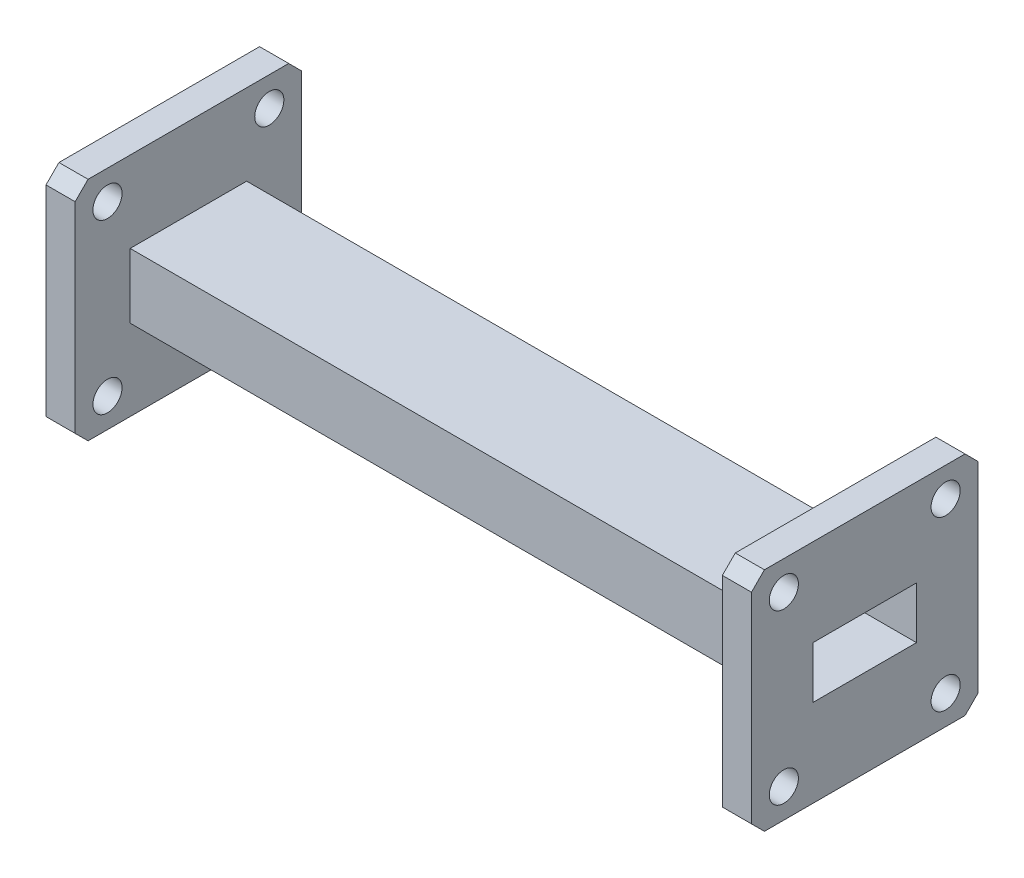
ISO-10303-21;
HEADER;
FILE_DESCRIPTION(('STEP AP214'),'2;1');
FILE_NAME('part.step','',(''),(''),'','','');
FILE_SCHEMA(('AUTOMOTIVE_DESIGN { 1 0 10303 214 1 1 1 1 }'));
ENDSEC;
DATA;
#1=APPLICATION_CONTEXT('core data for automotive mechanical design processes');
#2=APPLICATION_PROTOCOL_DEFINITION('international standard','automotive_design',2000,#1);
#3=PRODUCT_CONTEXT('',#1,'mechanical');
#4=PRODUCT('Part','Part','',(#3));
#5=PRODUCT_RELATED_PRODUCT_CATEGORY('part','',(#4));
#6=PRODUCT_DEFINITION_FORMATION('','',#4);
#7=PRODUCT_DEFINITION_CONTEXT('part definition',#1,'design');
#8=PRODUCT_DEFINITION('design','',#6,#7);
#9=PRODUCT_DEFINITION_SHAPE('','',#8);
#10=(LENGTH_UNIT() NAMED_UNIT(*) SI_UNIT(.MILLI.,.METRE.));
#11=(NAMED_UNIT(*) PLANE_ANGLE_UNIT() SI_UNIT($,.RADIAN.));
#12=(NAMED_UNIT(*) SI_UNIT($,.STERADIAN.) SOLID_ANGLE_UNIT());
#13=UNCERTAINTY_MEASURE_WITH_UNIT(LENGTH_MEASURE(1.E-05),#10,'distance_accuracy_value','');
#14=(GEOMETRIC_REPRESENTATION_CONTEXT(3) GLOBAL_UNCERTAINTY_ASSIGNED_CONTEXT((#13)) GLOBAL_UNIT_ASSIGNED_CONTEXT((#10,
#11,#12)) REPRESENTATION_CONTEXT('',''));
#15=CARTESIAN_POINT('',(0.,0.,0.));
#16=DIRECTION('',(0.,0.,1.));
#17=DIRECTION('',(1.,0.,0.));
#18=AXIS2_PLACEMENT_3D('',#15,#16,#17);
#19=CARTESIAN_POINT('',(4.5,0.,0.));
#20=DIRECTION('',(-1.,0.,0.));
#21=DIRECTION('',(0.,0.,1.));
#22=AXIS2_PLACEMENT_3D('',#19,#20,#21);
#23=PLANE('',#22);
#24=CARTESIAN_POINT('',(4.5,-13.,-12.5));
#25=DIRECTION('',(-1.,0.,0.));
#26=DIRECTION('',(0.,0.,1.));
#27=AXIS2_PLACEMENT_3D('',#24,#25,#26);
#28=CIRCLE('',#27,2.24999999999992);
#29=CARTESIAN_POINT('',(4.5,-13.,-10.2500000000001));
#30=VERTEX_POINT('',#29);
#31=EDGE_CURVE('E660',#30,#30,#28,.T.);
#32=ORIENTED_EDGE('',*,*,#31,.T.);
#33=EDGE_LOOP('',(#32));
#34=FACE_BOUND('',#33,.T.);
#35=CARTESIAN_POINT('',(4.5,13.,-12.5));
#36=DIRECTION('',(-1.,0.,0.));
#37=DIRECTION('',(0.,0.,1.));
#38=AXIS2_PLACEMENT_3D('',#35,#36,#37);
#39=CIRCLE('',#38,2.24999999999992);
#40=CARTESIAN_POINT('',(4.5,13.,-10.2500000000001));
#41=VERTEX_POINT('',#40);
#42=EDGE_CURVE('E406',#41,#41,#39,.T.);
#43=ORIENTED_EDGE('',*,*,#42,.T.);
#44=EDGE_LOOP('',(#43));
#45=FACE_BOUND('',#44,.T.);
#46=CARTESIAN_POINT('',(4.5,-13.,12.5));
#47=DIRECTION('',(-1.,0.,0.));
#48=DIRECTION('',(0.,0.,1.));
#49=AXIS2_PLACEMENT_3D('',#46,#47,#48);
#50=CIRCLE('',#49,2.24999999999992);
#51=CARTESIAN_POINT('',(4.5,-13.,14.7499999999999));
#52=VERTEX_POINT('',#51);
#53=EDGE_CURVE('E393',#52,#52,#50,.T.);
#54=ORIENTED_EDGE('',*,*,#53,.T.);
#55=EDGE_LOOP('',(#54));
#56=FACE_BOUND('',#55,.T.);
#57=CARTESIAN_POINT('',(4.5,13.,12.5));
#58=DIRECTION('',(-1.,0.,0.));
#59=DIRECTION('',(0.,0.,1.));
#60=AXIS2_PLACEMENT_3D('',#57,#58,#59);
#61=CIRCLE('',#60,2.24999999999992);
#62=CARTESIAN_POINT('',(4.5,13.,14.7499999999999));
#63=VERTEX_POINT('',#62);
#64=EDGE_CURVE('E217',#63,#63,#61,.T.);
#65=ORIENTED_EDGE('',*,*,#64,.T.);
#66=EDGE_LOOP('',(#65));
#67=FACE_BOUND('',#66,.T.);
#68=DIRECTION('',(0.,-1.,0.));
#69=VECTOR('',#68,1.);
#70=CARTESIAN_POINT('',(4.5,-17.5,17.5));
#71=LINE('',#70,#69);
#72=CARTESIAN_POINT('',(4.5,15.5,17.5));
#73=VERTEX_POINT('',#72);
#74=CARTESIAN_POINT('',(4.5,-15.5,17.5));
#75=VERTEX_POINT('',#74);
#76=EDGE_CURVE('E305',#73,#75,#71,.T.);
#77=ORIENTED_EDGE('',*,*,#76,.T.);
#78=DIRECTION('',(0.,0.707106781186548,0.707106781186548));
#79=VECTOR('',#78,1.);
#80=CARTESIAN_POINT('',(4.5,-17.5,15.5));
#81=LINE('',#80,#79);
#82=CARTESIAN_POINT('',(4.5,-17.5,15.5));
#83=VERTEX_POINT('',#82);
#84=EDGE_CURVE('E345',#75,#83,#81,.F.);
#85=ORIENTED_EDGE('',*,*,#84,.T.);
#86=DIRECTION('',(0.,0.,-1.));
#87=VECTOR('',#86,1.);
#88=CARTESIAN_POINT('',(4.5,-17.5,17.5));
#89=LINE('',#88,#87);
#90=CARTESIAN_POINT('',(4.5,-17.5,-15.5));
#91=VERTEX_POINT('',#90);
#92=EDGE_CURVE('E308',#83,#91,#89,.T.);
#93=ORIENTED_EDGE('',*,*,#92,.T.);
#94=DIRECTION('',(0.,-0.707106781186548,0.707106781186548));
#95=VECTOR('',#94,1.);
#96=CARTESIAN_POINT('',(4.5,-15.5,-17.5));
#97=LINE('',#96,#95);
#98=CARTESIAN_POINT('',(4.5,-15.5,-17.5));
#99=VERTEX_POINT('',#98);
#100=EDGE_CURVE('E343',#91,#99,#97,.F.);
#101=ORIENTED_EDGE('',*,*,#100,.T.);
#102=DIRECTION('',(0.,1.,0.));
#103=VECTOR('',#102,1.);
#104=CARTESIAN_POINT('',(4.5,-17.5,-17.5));
#105=LINE('',#104,#103);
#106=CARTESIAN_POINT('',(4.5,15.5,-17.5));
#107=VERTEX_POINT('',#106);
#108=EDGE_CURVE('E298',#99,#107,#105,.T.);
#109=ORIENTED_EDGE('',*,*,#108,.T.);
#110=DIRECTION('',(0.,-0.707106781186548,-0.707106781186548));
#111=VECTOR('',#110,1.);
#112=CARTESIAN_POINT('',(4.5,17.5,-15.5));
#113=LINE('',#112,#111);
#114=CARTESIAN_POINT('',(4.5,17.5,-15.5));
#115=VERTEX_POINT('',#114);
#116=EDGE_CURVE('E341',#107,#115,#113,.F.);
#117=ORIENTED_EDGE('',*,*,#116,.T.);
#118=DIRECTION('',(0.,0.,1.));
#119=VECTOR('',#118,1.);
#120=CARTESIAN_POINT('',(4.5,17.5,17.5));
#121=LINE('',#120,#119);
#122=CARTESIAN_POINT('',(4.5,17.5,15.5));
#123=VERTEX_POINT('',#122);
#124=EDGE_CURVE('E301',#115,#123,#121,.T.);
#125=ORIENTED_EDGE('',*,*,#124,.T.);
#126=DIRECTION('',(0.,0.707106781186548,-0.707106781186548));
#127=VECTOR('',#126,1.);
#128=CARTESIAN_POINT('',(4.5,15.5,17.5));
#129=LINE('',#128,#127);
#130=EDGE_CURVE('E339',#123,#73,#129,.F.);
#131=ORIENTED_EDGE('',*,*,#130,.T.);
#132=EDGE_LOOP('',(#77,#85,#93,#101,#109,#117,#125,#131));
#133=FACE_BOUND('',#132,.T.);
#134=DIRECTION('',(0.,1.,0.));
#135=VECTOR('',#134,1.);
#136=CARTESIAN_POINT('',(4.5,-5.00000000000001,-9.));
#137=LINE('',#136,#135);
#138=CARTESIAN_POINT('',(4.5,-5.00000000000001,-9.));
#139=VERTEX_POINT('',#138);
#140=CARTESIAN_POINT('',(4.5,5.00000000000001,-9.));
#141=VERTEX_POINT('',#140);
#142=EDGE_CURVE('E240',#139,#141,#137,.T.);
#143=ORIENTED_EDGE('',*,*,#142,.F.);
#144=DIRECTION('',(0.,0.,-1.));
#145=VECTOR('',#144,1.);
#146=CARTESIAN_POINT('',(4.5,-5.00000000000001,9.));
#147=LINE('',#146,#145);
#148=CARTESIAN_POINT('',(4.5,-5.00000000000001,9.));
#149=VERTEX_POINT('',#148);
#150=EDGE_CURVE('E254',#149,#139,#147,.T.);
#151=ORIENTED_EDGE('',*,*,#150,.F.);
#152=DIRECTION('',(0.,-1.,0.));
#153=VECTOR('',#152,1.);
#154=CARTESIAN_POINT('',(4.5,-5.00000000000001,9.));
#155=LINE('',#154,#153);
#156=CARTESIAN_POINT('',(4.5,5.00000000000001,9.));
#157=VERTEX_POINT('',#156);
#158=EDGE_CURVE('E269',#157,#149,#155,.T.);
#159=ORIENTED_EDGE('',*,*,#158,.F.);
#160=DIRECTION('',(0.,0.,1.));
#161=VECTOR('',#160,1.);
#162=CARTESIAN_POINT('',(4.5,5.00000000000001,9.));
#163=LINE('',#162,#161);
#164=EDGE_CURVE('E266',#141,#157,#163,.T.);
#165=ORIENTED_EDGE('',*,*,#164,.F.);
#166=EDGE_LOOP('',(#143,#151,#159,#165));
#167=FACE_BOUND('',#166,.T.);
#168=ADVANCED_FACE('F32',(#34,#45,#56,#67,#133,#167),#23,.F.);
#169=CARTESIAN_POINT('',(0.,0.,0.));
#170=DIRECTION('',(-1.,0.,0.));
#171=DIRECTION('',(0.,0.,1.));
#172=AXIS2_PLACEMENT_3D('',#169,#170,#171);
#173=PLANE('',#172);
#174=CARTESIAN_POINT('',(0.,-13.,-12.5));
#175=DIRECTION('',(-1.,0.,0.));
#176=DIRECTION('',(0.,0.,1.));
#177=AXIS2_PLACEMENT_3D('',#174,#175,#176);
#178=CIRCLE('',#177,2.24999999999999);
#179=CARTESIAN_POINT('',(0.,-13.,-10.25));
#180=VERTEX_POINT('',#179);
#181=EDGE_CURVE('E658',#180,#180,#178,.T.);
#182=ORIENTED_EDGE('',*,*,#181,.F.);
#183=EDGE_LOOP('',(#182));
#184=FACE_BOUND('',#183,.T.);
#185=CARTESIAN_POINT('',(0.,13.,-12.5));
#186=DIRECTION('',(-1.,0.,0.));
#187=DIRECTION('',(0.,0.,1.));
#188=AXIS2_PLACEMENT_3D('',#185,#186,#187);
#189=CIRCLE('',#188,2.24999999999999);
#190=CARTESIAN_POINT('',(0.,13.,-10.25));
#191=VERTEX_POINT('',#190);
#192=EDGE_CURVE('E661',#191,#191,#189,.T.);
#193=ORIENTED_EDGE('',*,*,#192,.F.);
#194=EDGE_LOOP('',(#193));
#195=FACE_BOUND('',#194,.T.);
#196=CARTESIAN_POINT('',(0.,-13.,12.5));
#197=DIRECTION('',(-1.,0.,0.));
#198=DIRECTION('',(0.,0.,1.));
#199=AXIS2_PLACEMENT_3D('',#196,#197,#198);
#200=CIRCLE('',#199,2.24999999999999);
#201=CARTESIAN_POINT('',(0.,-13.,14.75));
#202=VERTEX_POINT('',#201);
#203=EDGE_CURVE('E401',#202,#202,#200,.T.);
#204=ORIENTED_EDGE('',*,*,#203,.F.);
#205=EDGE_LOOP('',(#204));
#206=FACE_BOUND('',#205,.T.);
#207=CARTESIAN_POINT('',(0.,13.,12.5));
#208=DIRECTION('',(-1.,0.,0.));
#209=DIRECTION('',(0.,0.,1.));
#210=AXIS2_PLACEMENT_3D('',#207,#208,#209);
#211=CIRCLE('',#210,2.24999999999999);
#212=CARTESIAN_POINT('',(0.,13.,14.75));
#213=VERTEX_POINT('',#212);
#214=EDGE_CURVE('E398',#213,#213,#211,.T.);
#215=ORIENTED_EDGE('',*,*,#214,.F.);
#216=EDGE_LOOP('',(#215));
#217=FACE_BOUND('',#216,.T.);
#218=DIRECTION('',(0.,0.,-1.));
#219=VECTOR('',#218,1.);
#220=CARTESIAN_POINT('',(0.,-17.5,17.5));
#221=LINE('',#220,#219);
#222=CARTESIAN_POINT('',(0.,-17.5,15.5));
#223=VERTEX_POINT('',#222);
#224=CARTESIAN_POINT('',(0.,-17.5,-15.5));
#225=VERTEX_POINT('',#224);
#226=EDGE_CURVE('E302',#223,#225,#221,.T.);
#227=ORIENTED_EDGE('',*,*,#226,.F.);
#228=DIRECTION('',(0.,-0.707106781186548,-0.707106781186548));
#229=VECTOR('',#228,1.);
#230=CARTESIAN_POINT('',(0.,-16.5,16.5));
#231=LINE('',#230,#229);
#232=CARTESIAN_POINT('',(0.,-15.5,17.5));
#233=VERTEX_POINT('',#232);
#234=EDGE_CURVE('E332',#223,#233,#231,.F.);
#235=ORIENTED_EDGE('',*,*,#234,.T.);
#236=DIRECTION('',(0.,-1.,0.));
#237=VECTOR('',#236,1.);
#238=CARTESIAN_POINT('',(0.,-17.5,17.5));
#239=LINE('',#238,#237);
#240=CARTESIAN_POINT('',(0.,15.5,17.5));
#241=VERTEX_POINT('',#240);
#242=EDGE_CURVE('E317',#241,#233,#239,.T.);
#243=ORIENTED_EDGE('',*,*,#242,.F.);
#244=DIRECTION('',(0.,-0.707106781186548,0.707106781186548));
#245=VECTOR('',#244,1.);
#246=CARTESIAN_POINT('',(0.,16.5,16.5));
#247=LINE('',#246,#245);
#248=CARTESIAN_POINT('',(0.,17.5,15.5));
#249=VERTEX_POINT('',#248);
#250=EDGE_CURVE('E326',#241,#249,#247,.F.);
#251=ORIENTED_EDGE('',*,*,#250,.T.);
#252=DIRECTION('',(0.,0.,1.));
#253=VECTOR('',#252,1.);
#254=CARTESIAN_POINT('',(0.,17.5,17.5));
#255=LINE('',#254,#253);
#256=CARTESIAN_POINT('',(0.,17.5,-15.5));
#257=VERTEX_POINT('',#256);
#258=EDGE_CURVE('E314',#257,#249,#255,.T.);
#259=ORIENTED_EDGE('',*,*,#258,.F.);
#260=DIRECTION('',(0.,0.707106781186548,0.707106781186548));
#261=VECTOR('',#260,1.);
#262=CARTESIAN_POINT('',(0.,16.5,-16.5));
#263=LINE('',#262,#261);
#264=CARTESIAN_POINT('',(0.,15.5,-17.5));
#265=VERTEX_POINT('',#264);
#266=EDGE_CURVE('E328',#257,#265,#263,.F.);
#267=ORIENTED_EDGE('',*,*,#266,.T.);
#268=DIRECTION('',(0.,1.,0.));
#269=VECTOR('',#268,1.);
#270=CARTESIAN_POINT('',(0.,-17.5,-17.5));
#271=LINE('',#270,#269);
#272=CARTESIAN_POINT('',(0.,-15.5,-17.5));
#273=VERTEX_POINT('',#272);
#274=EDGE_CURVE('E206',#273,#265,#271,.T.);
#275=ORIENTED_EDGE('',*,*,#274,.F.);
#276=DIRECTION('',(0.,0.707106781186548,-0.707106781186548));
#277=VECTOR('',#276,1.);
#278=CARTESIAN_POINT('',(0.,-16.5,-16.5));
#279=LINE('',#278,#277);
#280=EDGE_CURVE('E330',#273,#225,#279,.F.);
#281=ORIENTED_EDGE('',*,*,#280,.T.);
#282=EDGE_LOOP('',(#227,#235,#243,#251,#259,#267,#275,#281));
#283=FACE_BOUND('',#282,.T.);
#284=DIRECTION('',(0.,0.,-1.));
#285=VECTOR('',#284,1.);
#286=CARTESIAN_POINT('',(0.,-3.99999999999999,8.));
#287=LINE('',#286,#285);
#288=CARTESIAN_POINT('',(0.,-3.99999999999999,8.));
#289=VERTEX_POINT('',#288);
#290=CARTESIAN_POINT('',(0.,-3.99999999999999,-8.));
#291=VERTEX_POINT('',#290);
#292=EDGE_CURVE('E291',#289,#291,#287,.T.);
#293=ORIENTED_EDGE('',*,*,#292,.T.);
#294=DIRECTION('',(0.,1.,0.));
#295=VECTOR('',#294,1.);
#296=CARTESIAN_POINT('',(0.,-3.99999999999999,-8.));
#297=LINE('',#296,#295);
#298=CARTESIAN_POINT('',(0.,4.00000000000001,-8.));
#299=VERTEX_POINT('',#298);
#300=EDGE_CURVE('E285',#291,#299,#297,.T.);
#301=ORIENTED_EDGE('',*,*,#300,.T.);
#302=DIRECTION('',(0.,0.,1.));
#303=VECTOR('',#302,1.);
#304=CARTESIAN_POINT('',(0.,4.00000000000001,8.));
#305=LINE('',#304,#303);
#306=CARTESIAN_POINT('',(0.,4.00000000000001,8.));
#307=VERTEX_POINT('',#306);
#308=EDGE_CURVE('E203',#299,#307,#305,.T.);
#309=ORIENTED_EDGE('',*,*,#308,.T.);
#310=DIRECTION('',(0.,-1.,0.));
#311=VECTOR('',#310,1.);
#312=CARTESIAN_POINT('',(0.,-3.99999999999999,8.));
#313=LINE('',#312,#311);
#314=EDGE_CURVE('E288',#307,#289,#313,.T.);
#315=ORIENTED_EDGE('',*,*,#314,.T.);
#316=EDGE_LOOP('',(#293,#301,#309,#315));
#317=FACE_BOUND('',#316,.T.);
#318=ADVANCED_FACE('F433',(#184,#195,#206,#217,#283,#317),#173,.T.);
#319=CARTESIAN_POINT('',(4.5,-17.5,-17.5));
#320=DIRECTION('',(0.,0.,1.));
#321=DIRECTION('',(1.,0.,0.));
#322=AXIS2_PLACEMENT_3D('',#319,#320,#321);
#323=PLANE('',#322);
#324=ORIENTED_EDGE('',*,*,#108,.F.);
#325=DIRECTION('',(-1.,0.,0.));
#326=VECTOR('',#325,1.);
#327=CARTESIAN_POINT('',(4.5,-15.5,-17.5));
#328=LINE('',#327,#326);
#329=EDGE_CURVE('E349',#99,#273,#328,.T.);
#330=ORIENTED_EDGE('',*,*,#329,.T.);
#331=ORIENTED_EDGE('',*,*,#274,.T.);
#332=DIRECTION('',(1.,0.,0.));
#333=VECTOR('',#332,1.);
#334=CARTESIAN_POINT('',(4.5,15.5,-17.5));
#335=LINE('',#334,#333);
#336=EDGE_CURVE('E347',#265,#107,#335,.T.);
#337=ORIENTED_EDGE('',*,*,#336,.T.);
#338=EDGE_LOOP('',(#324,#330,#331,#337));
#339=FACE_BOUND('',#338,.T.);
#340=ADVANCED_FACE('F439',(#339),#323,.F.);
#341=CARTESIAN_POINT('',(4.5,17.5,17.5));
#342=DIRECTION('',(0.,-1.,0.));
#343=DIRECTION('',(0.,0.,-1.));
#344=AXIS2_PLACEMENT_3D('',#341,#342,#343);
#345=PLANE('',#344);
#346=ORIENTED_EDGE('',*,*,#124,.F.);
#347=DIRECTION('',(-1.,0.,0.));
#348=VECTOR('',#347,1.);
#349=CARTESIAN_POINT('',(4.5,17.5,-15.5));
#350=LINE('',#349,#348);
#351=EDGE_CURVE('E354',#115,#257,#350,.T.);
#352=ORIENTED_EDGE('',*,*,#351,.T.);
#353=ORIENTED_EDGE('',*,*,#258,.T.);
#354=DIRECTION('',(1.,0.,0.));
#355=VECTOR('',#354,1.);
#356=CARTESIAN_POINT('',(4.5,17.5,15.5));
#357=LINE('',#356,#355);
#358=EDGE_CURVE('E352',#249,#123,#357,.T.);
#359=ORIENTED_EDGE('',*,*,#358,.T.);
#360=EDGE_LOOP('',(#346,#352,#353,#359));
#361=FACE_BOUND('',#360,.T.);
#362=ADVANCED_FACE('F454',(#361),#345,.F.);
#363=CARTESIAN_POINT('',(4.5,-17.5,17.5));
#364=DIRECTION('',(0.,0.,-1.));
#365=DIRECTION('',(-1.,0.,0.));
#366=AXIS2_PLACEMENT_3D('',#363,#364,#365);
#367=PLANE('',#366);
#368=ORIENTED_EDGE('',*,*,#242,.T.);
#369=DIRECTION('',(1.,0.,0.));
#370=VECTOR('',#369,1.);
#371=CARTESIAN_POINT('',(4.5,-15.5,17.5));
#372=LINE('',#371,#370);
#373=EDGE_CURVE('E337',#233,#75,#372,.T.);
#374=ORIENTED_EDGE('',*,*,#373,.T.);
#375=ORIENTED_EDGE('',*,*,#76,.F.);
#376=DIRECTION('',(-1.,0.,0.));
#377=VECTOR('',#376,1.);
#378=CARTESIAN_POINT('',(4.5,15.5,17.5));
#379=LINE('',#378,#377);
#380=EDGE_CURVE('E334',#73,#241,#379,.T.);
#381=ORIENTED_EDGE('',*,*,#380,.T.);
#382=EDGE_LOOP('',(#368,#374,#375,#381));
#383=FACE_BOUND('',#382,.T.);
#384=ADVANCED_FACE('F450',(#383),#367,.F.);
#385=CARTESIAN_POINT('',(4.5,-17.5,17.5));
#386=DIRECTION('',(0.,1.,0.));
#387=DIRECTION('',(0.,0.,1.));
#388=AXIS2_PLACEMENT_3D('',#385,#386,#387);
#389=PLANE('',#388);
#390=ORIENTED_EDGE('',*,*,#92,.F.);
#391=DIRECTION('',(-1.,0.,0.));
#392=VECTOR('',#391,1.);
#393=CARTESIAN_POINT('',(4.5,-17.5,15.5));
#394=LINE('',#393,#392);
#395=EDGE_CURVE('E323',#83,#223,#394,.T.);
#396=ORIENTED_EDGE('',*,*,#395,.T.);
#397=ORIENTED_EDGE('',*,*,#226,.T.);
#398=DIRECTION('',(1.,0.,0.));
#399=VECTOR('',#398,1.);
#400=CARTESIAN_POINT('',(4.5,-17.5,-15.5));
#401=LINE('',#400,#399);
#402=EDGE_CURVE('E311',#225,#91,#401,.T.);
#403=ORIENTED_EDGE('',*,*,#402,.T.);
#404=EDGE_LOOP('',(#390,#396,#397,#403));
#405=FACE_BOUND('',#404,.T.);
#406=ADVANCED_FACE('F447',(#405),#389,.F.);
#407=CARTESIAN_POINT('',(4.5,-3.99999999999999,-8.));
#408=DIRECTION('',(0.,0.,1.));
#409=DIRECTION('',(1.,0.,0.));
#410=AXIS2_PLACEMENT_3D('',#407,#408,#409);
#411=PLANE('',#410);
#412=ORIENTED_EDGE('',*,*,#300,.F.);
#413=DIRECTION('',(-1.,0.,0.));
#414=VECTOR('',#413,1.);
#415=CARTESIAN_POINT('',(4.5,-3.99999999999999,-8.));
#416=LINE('',#415,#414);
#417=CARTESIAN_POINT('',(109.,-4.00000000000002,-8.));
#418=VERTEX_POINT('',#417);
#419=EDGE_CURVE('E213',#418,#291,#416,.T.);
#420=ORIENTED_EDGE('',*,*,#419,.F.);
#421=DIRECTION('',(0.,1.,0.));
#422=VECTOR('',#421,1.);
#423=CARTESIAN_POINT('',(109.,-4.00000000000002,-8.));
#424=LINE('',#423,#422);
#425=CARTESIAN_POINT('',(109.,4.00000000000001,-8.));
#426=VERTEX_POINT('',#425);
#427=EDGE_CURVE('E210',#418,#426,#424,.T.);
#428=ORIENTED_EDGE('',*,*,#427,.T.);
#429=DIRECTION('',(-1.,0.,0.));
#430=VECTOR('',#429,1.);
#431=CARTESIAN_POINT('',(4.5,4.00000000000001,-8.));
#432=LINE('',#431,#430);
#433=EDGE_CURVE('E196',#426,#299,#432,.T.);
#434=ORIENTED_EDGE('',*,*,#433,.T.);
#435=EDGE_LOOP('',(#412,#420,#428,#434));
#436=FACE_BOUND('',#435,.T.);
#437=ADVANCED_FACE('F211',(#436),#411,.T.);
#438=CARTESIAN_POINT('',(4.5,4.00000000000001,8.));
#439=DIRECTION('',(0.,-1.,0.));
#440=DIRECTION('',(0.,0.,-1.));
#441=AXIS2_PLACEMENT_3D('',#438,#439,#440);
#442=PLANE('',#441);
#443=ORIENTED_EDGE('',*,*,#308,.F.);
#444=ORIENTED_EDGE('',*,*,#433,.F.);
#445=DIRECTION('',(0.,0.,1.));
#446=VECTOR('',#445,1.);
#447=CARTESIAN_POINT('',(109.,4.00000000000001,8.00000000000002));
#448=LINE('',#447,#446);
#449=CARTESIAN_POINT('',(109.,4.00000000000001,8.00000000000002));
#450=VERTEX_POINT('',#449);
#451=EDGE_CURVE('E200',#426,#450,#448,.T.);
#452=ORIENTED_EDGE('',*,*,#451,.T.);
#453=DIRECTION('',(-1.,0.,0.));
#454=VECTOR('',#453,1.);
#455=CARTESIAN_POINT('',(4.5,4.00000000000001,8.));
#456=LINE('',#455,#454);
#457=EDGE_CURVE('E207',#450,#307,#456,.T.);
#458=ORIENTED_EDGE('',*,*,#457,.T.);
#459=EDGE_LOOP('',(#443,#444,#452,#458));
#460=FACE_BOUND('',#459,.T.);
#461=ADVANCED_FACE('F198',(#460),#442,.T.);
#462=CARTESIAN_POINT('',(4.5,-3.99999999999999,8.));
#463=DIRECTION('',(0.,0.,-1.));
#464=DIRECTION('',(-1.,0.,0.));
#465=AXIS2_PLACEMENT_3D('',#462,#463,#464);
#466=PLANE('',#465);
#467=ORIENTED_EDGE('',*,*,#314,.F.);
#468=ORIENTED_EDGE('',*,*,#457,.F.);
#469=DIRECTION('',(0.,-1.,0.));
#470=VECTOR('',#469,1.);
#471=CARTESIAN_POINT('',(109.,-4.00000000000002,8.00000000000002));
#472=LINE('',#471,#470);
#473=CARTESIAN_POINT('',(109.,-4.00000000000002,8.00000000000002));
#474=VERTEX_POINT('',#473);
#475=EDGE_CURVE('E221',#450,#474,#472,.T.);
#476=ORIENTED_EDGE('',*,*,#475,.T.);
#477=DIRECTION('',(-1.,0.,0.));
#478=VECTOR('',#477,1.);
#479=CARTESIAN_POINT('',(4.5,-3.99999999999999,8.));
#480=LINE('',#479,#478);
#481=EDGE_CURVE('E295',#474,#289,#480,.T.);
#482=ORIENTED_EDGE('',*,*,#481,.T.);
#483=EDGE_LOOP('',(#467,#468,#476,#482));
#484=FACE_BOUND('',#483,.T.);
#485=ADVANCED_FACE('F548',(#484),#466,.T.);
#486=CARTESIAN_POINT('',(4.5,-3.99999999999999,8.));
#487=DIRECTION('',(0.,1.,0.));
#488=DIRECTION('',(0.,0.,1.));
#489=AXIS2_PLACEMENT_3D('',#486,#487,#488);
#490=PLANE('',#489);
#491=ORIENTED_EDGE('',*,*,#292,.F.);
#492=ORIENTED_EDGE('',*,*,#481,.F.);
#493=DIRECTION('',(0.,0.,-1.));
#494=VECTOR('',#493,1.);
#495=CARTESIAN_POINT('',(109.,-4.00000000000002,8.00000000000002));
#496=LINE('',#495,#494);
#497=EDGE_CURVE('E223',#474,#418,#496,.T.);
#498=ORIENTED_EDGE('',*,*,#497,.T.);
#499=ORIENTED_EDGE('',*,*,#419,.T.);
#500=EDGE_LOOP('',(#491,#492,#498,#499));
#501=FACE_BOUND('',#500,.T.);
#502=ADVANCED_FACE('F466',(#501),#490,.T.);
#503=CARTESIAN_POINT('',(4.5,-17.5,15.5));
#504=DIRECTION('',(0.,0.707106781186548,-0.707106781186548));
#505=DIRECTION('',(-1.,0.,0.));
#506=AXIS2_PLACEMENT_3D('',#503,#504,#505);
#507=PLANE('',#506);
#508=ORIENTED_EDGE('',*,*,#84,.F.);
#509=ORIENTED_EDGE('',*,*,#373,.F.);
#510=ORIENTED_EDGE('',*,*,#234,.F.);
#511=ORIENTED_EDGE('',*,*,#395,.F.);
#512=EDGE_LOOP('',(#508,#509,#510,#511));
#513=FACE_BOUND('',#512,.T.);
#514=ADVANCED_FACE('F462',(#513),#507,.F.);
#515=CARTESIAN_POINT('',(4.5,-15.5,-17.5));
#516=DIRECTION('',(0.,0.707106781186548,0.707106781186548));
#517=DIRECTION('',(-1.,0.,0.));
#518=AXIS2_PLACEMENT_3D('',#515,#516,#517);
#519=PLANE('',#518);
#520=ORIENTED_EDGE('',*,*,#100,.F.);
#521=ORIENTED_EDGE('',*,*,#402,.F.);
#522=ORIENTED_EDGE('',*,*,#280,.F.);
#523=ORIENTED_EDGE('',*,*,#329,.F.);
#524=EDGE_LOOP('',(#520,#521,#522,#523));
#525=FACE_BOUND('',#524,.T.);
#526=ADVANCED_FACE('F465',(#525),#519,.F.);
#527=CARTESIAN_POINT('',(4.5,17.5,-15.5));
#528=DIRECTION('',(0.,-0.707106781186548,0.707106781186548));
#529=DIRECTION('',(-1.,0.,0.));
#530=AXIS2_PLACEMENT_3D('',#527,#528,#529);
#531=PLANE('',#530);
#532=ORIENTED_EDGE('',*,*,#116,.F.);
#533=ORIENTED_EDGE('',*,*,#336,.F.);
#534=ORIENTED_EDGE('',*,*,#266,.F.);
#535=ORIENTED_EDGE('',*,*,#351,.F.);
#536=EDGE_LOOP('',(#532,#533,#534,#535));
#537=FACE_BOUND('',#536,.T.);
#538=ADVANCED_FACE('F470',(#537),#531,.F.);
#539=CARTESIAN_POINT('',(4.5,15.5,17.5));
#540=DIRECTION('',(0.,-0.707106781186548,-0.707106781186548));
#541=DIRECTION('',(-1.,0.,0.));
#542=AXIS2_PLACEMENT_3D('',#539,#540,#541);
#543=PLANE('',#542);
#544=ORIENTED_EDGE('',*,*,#130,.F.);
#545=ORIENTED_EDGE('',*,*,#358,.F.);
#546=ORIENTED_EDGE('',*,*,#250,.F.);
#547=ORIENTED_EDGE('',*,*,#380,.F.);
#548=EDGE_LOOP('',(#544,#545,#546,#547));
#549=FACE_BOUND('',#548,.T.);
#550=ADVANCED_FACE('F474',(#549),#543,.F.);
#551=CARTESIAN_POINT('',(104.5,-5.00000000000001,-9.));
#552=DIRECTION('',(0.,0.,1.));
#553=DIRECTION('',(1.,0.,0.));
#554=AXIS2_PLACEMENT_3D('',#551,#552,#553);
#555=PLANE('',#554);
#556=ORIENTED_EDGE('',*,*,#142,.T.);
#557=DIRECTION('',(-1.,0.,0.));
#558=VECTOR('',#557,1.);
#559=CARTESIAN_POINT('',(104.5,5.00000000000001,-9.));
#560=LINE('',#559,#558);
#561=CARTESIAN_POINT('',(104.5,5.00000000000001,-9.));
#562=VERTEX_POINT('',#561);
#563=EDGE_CURVE('E282',#562,#141,#560,.T.);
#564=ORIENTED_EDGE('',*,*,#563,.F.);
#565=DIRECTION('',(0.,1.,0.));
#566=VECTOR('',#565,1.);
#567=CARTESIAN_POINT('',(104.5,-5.00000000000001,-9.));
#568=LINE('',#567,#566);
#569=CARTESIAN_POINT('',(104.5,-5.00000000000001,-9.));
#570=VERTEX_POINT('',#569);
#571=EDGE_CURVE('E250',#570,#562,#568,.T.);
#572=ORIENTED_EDGE('',*,*,#571,.F.);
#573=DIRECTION('',(-1.,0.,0.));
#574=VECTOR('',#573,1.);
#575=CARTESIAN_POINT('',(104.5,-5.00000000000001,-9.));
#576=LINE('',#575,#574);
#577=EDGE_CURVE('E263',#570,#139,#576,.T.);
#578=ORIENTED_EDGE('',*,*,#577,.T.);
#579=EDGE_LOOP('',(#556,#564,#572,#578));
#580=FACE_BOUND('',#579,.T.);
#581=ADVANCED_FACE('F478',(#580),#555,.F.);
#582=CARTESIAN_POINT('',(104.5,5.00000000000001,9.));
#583=DIRECTION('',(0.,-1.,0.));
#584=DIRECTION('',(0.,0.,-1.));
#585=AXIS2_PLACEMENT_3D('',#582,#583,#584);
#586=PLANE('',#585);
#587=ORIENTED_EDGE('',*,*,#164,.T.);
#588=DIRECTION('',(-1.,0.,0.));
#589=VECTOR('',#588,1.);
#590=CARTESIAN_POINT('',(104.5,5.00000000000001,9.));
#591=LINE('',#590,#589);
#592=CARTESIAN_POINT('',(104.5,5.00000000000001,9.));
#593=VERTEX_POINT('',#592);
#594=EDGE_CURVE('E279',#593,#157,#591,.T.);
#595=ORIENTED_EDGE('',*,*,#594,.F.);
#596=DIRECTION('',(0.,0.,1.));
#597=VECTOR('',#596,1.);
#598=CARTESIAN_POINT('',(104.5,5.00000000000001,9.));
#599=LINE('',#598,#597);
#600=EDGE_CURVE('E253',#562,#593,#599,.T.);
#601=ORIENTED_EDGE('',*,*,#600,.F.);
#602=ORIENTED_EDGE('',*,*,#563,.T.);
#603=EDGE_LOOP('',(#587,#595,#601,#602));
#604=FACE_BOUND('',#603,.T.);
#605=ADVANCED_FACE('F538',(#604),#586,.F.);
#606=CARTESIAN_POINT('',(104.5,-5.00000000000001,9.));
#607=DIRECTION('',(0.,0.,-1.));
#608=DIRECTION('',(-1.,0.,0.));
#609=AXIS2_PLACEMENT_3D('',#606,#607,#608);
#610=PLANE('',#609);
#611=ORIENTED_EDGE('',*,*,#158,.T.);
#612=DIRECTION('',(-1.,0.,0.));
#613=VECTOR('',#612,1.);
#614=CARTESIAN_POINT('',(104.5,-5.00000000000001,9.));
#615=LINE('',#614,#613);
#616=CARTESIAN_POINT('',(104.5,-5.00000000000001,9.));
#617=VERTEX_POINT('',#616);
#618=EDGE_CURVE('E276',#617,#149,#615,.T.);
#619=ORIENTED_EDGE('',*,*,#618,.F.);
#620=DIRECTION('',(0.,-1.,0.));
#621=VECTOR('',#620,1.);
#622=CARTESIAN_POINT('',(104.5,-5.00000000000001,9.));
#623=LINE('',#622,#621);
#624=EDGE_CURVE('E257',#593,#617,#623,.T.);
#625=ORIENTED_EDGE('',*,*,#624,.F.);
#626=ORIENTED_EDGE('',*,*,#594,.T.);
#627=EDGE_LOOP('',(#611,#619,#625,#626));
#628=FACE_BOUND('',#627,.T.);
#629=ADVANCED_FACE('F534',(#628),#610,.F.);
#630=CARTESIAN_POINT('',(104.5,-5.00000000000001,9.));
#631=DIRECTION('',(0.,1.,0.));
#632=DIRECTION('',(0.,0.,1.));
#633=AXIS2_PLACEMENT_3D('',#630,#631,#632);
#634=PLANE('',#633);
#635=ORIENTED_EDGE('',*,*,#150,.T.);
#636=ORIENTED_EDGE('',*,*,#577,.F.);
#637=DIRECTION('',(0.,0.,-1.));
#638=VECTOR('',#637,1.);
#639=CARTESIAN_POINT('',(104.5,-5.00000000000001,9.));
#640=LINE('',#639,#638);
#641=EDGE_CURVE('E260',#617,#570,#640,.T.);
#642=ORIENTED_EDGE('',*,*,#641,.F.);
#643=ORIENTED_EDGE('',*,*,#618,.T.);
#644=EDGE_LOOP('',(#635,#636,#642,#643));
#645=FACE_BOUND('',#644,.T.);
#646=ADVANCED_FACE('F531',(#645),#634,.F.);
#647=CARTESIAN_POINT('',(109.,0.,0.));
#648=DIRECTION('',(-1.,0.,0.));
#649=DIRECTION('',(0.,0.,1.));
#650=AXIS2_PLACEMENT_3D('',#647,#648,#649);
#651=PLANE('',#650);
#652=CARTESIAN_POINT('',(109.,-13.,-12.5));
#653=DIRECTION('',(-1.,0.,0.));
#654=DIRECTION('',(0.,0.,1.));
#655=AXIS2_PLACEMENT_3D('',#652,#653,#654);
#656=CIRCLE('',#655,2.24999999999986);
#657=CARTESIAN_POINT('',(109.,-13.,-10.2500000000001));
#658=VERTEX_POINT('',#657);
#659=EDGE_CURVE('E668',#658,#658,#656,.T.);
#660=ORIENTED_EDGE('',*,*,#659,.T.);
#661=EDGE_LOOP('',(#660));
#662=FACE_BOUND('',#661,.T.);
#663=CARTESIAN_POINT('',(109.,13.,-12.5));
#664=DIRECTION('',(-1.,0.,0.));
#665=DIRECTION('',(0.,0.,1.));
#666=AXIS2_PLACEMENT_3D('',#663,#664,#665);
#667=CIRCLE('',#666,2.24999999999986);
#668=CARTESIAN_POINT('',(109.,13.,-10.2500000000001));
#669=VERTEX_POINT('',#668);
#670=EDGE_CURVE('E665',#669,#669,#667,.T.);
#671=ORIENTED_EDGE('',*,*,#670,.T.);
#672=EDGE_LOOP('',(#671));
#673=FACE_BOUND('',#672,.T.);
#674=CARTESIAN_POINT('',(109.,-13.,12.5));
#675=DIRECTION('',(-1.,0.,0.));
#676=DIRECTION('',(0.,0.,1.));
#677=AXIS2_PLACEMENT_3D('',#674,#675,#676);
#678=CIRCLE('',#677,2.24999999999986);
#679=CARTESIAN_POINT('',(109.,-13.,14.7499999999999));
#680=VERTEX_POINT('',#679);
#681=EDGE_CURVE('E394',#680,#680,#678,.T.);
#682=ORIENTED_EDGE('',*,*,#681,.T.);
#683=EDGE_LOOP('',(#682));
#684=FACE_BOUND('',#683,.T.);
#685=CARTESIAN_POINT('',(109.,13.,12.5));
#686=DIRECTION('',(-1.,0.,0.));
#687=DIRECTION('',(0.,0.,1.));
#688=AXIS2_PLACEMENT_3D('',#685,#686,#687);
#689=CIRCLE('',#688,2.24999999999986);
#690=CARTESIAN_POINT('',(109.,13.,14.7499999999999));
#691=VERTEX_POINT('',#690);
#692=EDGE_CURVE('E390',#691,#691,#689,.T.);
#693=ORIENTED_EDGE('',*,*,#692,.T.);
#694=EDGE_LOOP('',(#693));
#695=FACE_BOUND('',#694,.T.);
#696=DIRECTION('',(0.,-1.,0.));
#697=VECTOR('',#696,1.);
#698=CARTESIAN_POINT('',(109.,-17.5,17.5));
#699=LINE('',#698,#697);
#700=CARTESIAN_POINT('',(109.,15.5,17.5));
#701=VERTEX_POINT('',#700);
#702=CARTESIAN_POINT('',(109.,-15.5,17.5));
#703=VERTEX_POINT('',#702);
#704=EDGE_CURVE('E234',#701,#703,#699,.T.);
#705=ORIENTED_EDGE('',*,*,#704,.T.);
#706=DIRECTION('',(0.,0.70710678118655,0.707106781186545));
#707=VECTOR('',#706,1.);
#708=CARTESIAN_POINT('',(109.,-17.5,15.5));
#709=LINE('',#708,#707);
#710=CARTESIAN_POINT('',(109.,-17.5,15.5));
#711=VERTEX_POINT('',#710);
#712=EDGE_CURVE('E380',#703,#711,#709,.F.);
#713=ORIENTED_EDGE('',*,*,#712,.T.);
#714=DIRECTION('',(0.,0.,-1.));
#715=VECTOR('',#714,1.);
#716=CARTESIAN_POINT('',(109.,-17.5,17.5));
#717=LINE('',#716,#715);
#718=CARTESIAN_POINT('',(109.,-17.5,-15.5));
#719=VERTEX_POINT('',#718);
#720=EDGE_CURVE('E237',#711,#719,#717,.T.);
#721=ORIENTED_EDGE('',*,*,#720,.T.);
#722=DIRECTION('',(0.,-0.707106781186548,0.707106781186548));
#723=VECTOR('',#722,1.);
#724=CARTESIAN_POINT('',(109.,-15.5,-17.5));
#725=LINE('',#724,#723);
#726=CARTESIAN_POINT('',(109.,-15.5,-17.5));
#727=VERTEX_POINT('',#726);
#728=EDGE_CURVE('E378',#719,#727,#725,.F.);
#729=ORIENTED_EDGE('',*,*,#728,.T.);
#730=DIRECTION('',(0.,1.,0.));
#731=VECTOR('',#730,1.);
#732=CARTESIAN_POINT('',(109.,-17.5,-17.5));
#733=LINE('',#732,#731);
#734=CARTESIAN_POINT('',(109.,15.5,-17.5));
#735=VERTEX_POINT('',#734);
#736=EDGE_CURVE('E229',#727,#735,#733,.T.);
#737=ORIENTED_EDGE('',*,*,#736,.T.);
#738=DIRECTION('',(0.,-0.70710678118655,-0.707106781186545));
#739=VECTOR('',#738,1.);
#740=CARTESIAN_POINT('',(109.,17.5,-15.5));
#741=LINE('',#740,#739);
#742=CARTESIAN_POINT('',(109.,17.5,-15.5));
#743=VERTEX_POINT('',#742);
#744=EDGE_CURVE('E55',#735,#743,#741,.F.);
#745=ORIENTED_EDGE('',*,*,#744,.T.);
#746=DIRECTION('',(0.,0.,1.));
#747=VECTOR('',#746,1.);
#748=CARTESIAN_POINT('',(109.,17.5,17.5));
#749=LINE('',#748,#747);
#750=CARTESIAN_POINT('',(109.,17.5,15.5));
#751=VERTEX_POINT('',#750);
#752=EDGE_CURVE('E231',#743,#751,#749,.T.);
#753=ORIENTED_EDGE('',*,*,#752,.T.);
#754=DIRECTION('',(0.,0.707106781186548,-0.707106781186548));
#755=VECTOR('',#754,1.);
#756=CARTESIAN_POINT('',(109.,15.5,17.5));
#757=LINE('',#756,#755);
#758=EDGE_CURVE('E375',#751,#701,#757,.F.);
#759=ORIENTED_EDGE('',*,*,#758,.T.);
#760=EDGE_LOOP('',(#705,#713,#721,#729,#737,#745,#753,#759));
#761=FACE_BOUND('',#760,.T.);
#762=ORIENTED_EDGE('',*,*,#427,.F.);
#763=ORIENTED_EDGE('',*,*,#497,.F.);
#764=ORIENTED_EDGE('',*,*,#475,.F.);
#765=ORIENTED_EDGE('',*,*,#451,.F.);
#766=EDGE_LOOP('',(#762,#763,#764,#765));
#767=FACE_BOUND('',#766,.T.);
#768=ADVANCED_FACE('F219',(#662,#673,#684,#695,#761,#767),#651,.F.);
#769=CARTESIAN_POINT('',(104.5,0.,0.));
#770=DIRECTION('',(-1.,0.,0.));
#771=DIRECTION('',(0.,0.,1.));
#772=AXIS2_PLACEMENT_3D('',#769,#770,#771);
#773=PLANE('',#772);
#774=CARTESIAN_POINT('',(104.5,-13.,-12.5));
#775=DIRECTION('',(-1.,0.,0.));
#776=DIRECTION('',(0.,0.,1.));
#777=AXIS2_PLACEMENT_3D('',#774,#775,#776);
#778=CIRCLE('',#777,2.24999999999992);
#779=CARTESIAN_POINT('',(104.5,-13.,-10.2500000000001));
#780=VERTEX_POINT('',#779);
#781=EDGE_CURVE('E662',#780,#780,#778,.T.);
#782=ORIENTED_EDGE('',*,*,#781,.F.);
#783=EDGE_LOOP('',(#782));
#784=FACE_BOUND('',#783,.T.);
#785=CARTESIAN_POINT('',(104.5,13.,-12.5));
#786=DIRECTION('',(-1.,0.,0.));
#787=DIRECTION('',(0.,0.,1.));
#788=AXIS2_PLACEMENT_3D('',#785,#786,#787);
#789=CIRCLE('',#788,2.24999999999992);
#790=CARTESIAN_POINT('',(104.5,13.,-10.2500000000001));
#791=VERTEX_POINT('',#790);
#792=EDGE_CURVE('E36',#791,#791,#789,.T.);
#793=ORIENTED_EDGE('',*,*,#792,.F.);
#794=EDGE_LOOP('',(#793));
#795=FACE_BOUND('',#794,.T.);
#796=CARTESIAN_POINT('',(104.5,-13.,12.5));
#797=DIRECTION('',(-1.,0.,0.));
#798=DIRECTION('',(0.,0.,1.));
#799=AXIS2_PLACEMENT_3D('',#796,#797,#798);
#800=CIRCLE('',#799,2.24999999999992);
#801=CARTESIAN_POINT('',(104.5,-13.,14.7499999999999));
#802=VERTEX_POINT('',#801);
#803=EDGE_CURVE('E391',#802,#802,#800,.T.);
#804=ORIENTED_EDGE('',*,*,#803,.F.);
#805=EDGE_LOOP('',(#804));
#806=FACE_BOUND('',#805,.T.);
#807=CARTESIAN_POINT('',(104.5,13.,12.5));
#808=DIRECTION('',(-1.,0.,0.));
#809=DIRECTION('',(0.,0.,1.));
#810=AXIS2_PLACEMENT_3D('',#807,#808,#809);
#811=CIRCLE('',#810,2.24999999999992);
#812=CARTESIAN_POINT('',(104.5,13.,14.7499999999999));
#813=VERTEX_POINT('',#812);
#814=EDGE_CURVE('E388',#813,#813,#811,.T.);
#815=ORIENTED_EDGE('',*,*,#814,.F.);
#816=EDGE_LOOP('',(#815));
#817=FACE_BOUND('',#816,.T.);
#818=ORIENTED_EDGE('',*,*,#641,.T.);
#819=ORIENTED_EDGE('',*,*,#571,.T.);
#820=ORIENTED_EDGE('',*,*,#600,.T.);
#821=ORIENTED_EDGE('',*,*,#624,.T.);
#822=EDGE_LOOP('',(#818,#819,#820,#821));
#823=FACE_BOUND('',#822,.T.);
#824=DIRECTION('',(0.,0.,-1.));
#825=VECTOR('',#824,1.);
#826=CARTESIAN_POINT('',(104.5,-17.5,17.5));
#827=LINE('',#826,#825);
#828=CARTESIAN_POINT('',(104.5,-17.5,15.5));
#829=VERTEX_POINT('',#828);
#830=CARTESIAN_POINT('',(104.5,-17.5,-15.5));
#831=VERTEX_POINT('',#830);
#832=EDGE_CURVE('E232',#829,#831,#827,.T.);
#833=ORIENTED_EDGE('',*,*,#832,.F.);
#834=DIRECTION('',(0.,-0.70710678118655,-0.707106781186545));
#835=VECTOR('',#834,1.);
#836=CARTESIAN_POINT('',(104.5,-16.5,16.5000000000001));
#837=LINE('',#836,#835);
#838=CARTESIAN_POINT('',(104.5,-15.5,17.5));
#839=VERTEX_POINT('',#838);
#840=EDGE_CURVE('E368',#829,#839,#837,.F.);
#841=ORIENTED_EDGE('',*,*,#840,.T.);
#842=DIRECTION('',(0.,-1.,0.));
#843=VECTOR('',#842,1.);
#844=CARTESIAN_POINT('',(104.5,-17.5,17.5));
#845=LINE('',#844,#843);
#846=CARTESIAN_POINT('',(104.5,15.5,17.5));
#847=VERTEX_POINT('',#846);
#848=EDGE_CURVE('E245',#847,#839,#845,.T.);
#849=ORIENTED_EDGE('',*,*,#848,.F.);
#850=DIRECTION('',(0.,-0.707106781186548,0.707106781186548));
#851=VECTOR('',#850,1.);
#852=CARTESIAN_POINT('',(104.5,16.5,16.5));
#853=LINE('',#852,#851);
#854=CARTESIAN_POINT('',(104.5,17.5,15.5));
#855=VERTEX_POINT('',#854);
#856=EDGE_CURVE('E362',#847,#855,#853,.F.);
#857=ORIENTED_EDGE('',*,*,#856,.T.);
#858=DIRECTION('',(0.,0.,1.));
#859=VECTOR('',#858,1.);
#860=CARTESIAN_POINT('',(104.5,17.5,17.5));
#861=LINE('',#860,#859);
#862=CARTESIAN_POINT('',(104.5,17.5,-15.5));
#863=VERTEX_POINT('',#862);
#864=EDGE_CURVE('E243',#863,#855,#861,.T.);
#865=ORIENTED_EDGE('',*,*,#864,.F.);
#866=DIRECTION('',(0.,0.70710678118655,0.707106781186545));
#867=VECTOR('',#866,1.);
#868=CARTESIAN_POINT('',(104.5,16.4999999999999,-16.5000000000001));
#869=LINE('',#868,#867);
#870=CARTESIAN_POINT('',(104.5,15.5,-17.5));
#871=VERTEX_POINT('',#870);
#872=EDGE_CURVE('E364',#863,#871,#869,.F.);
#873=ORIENTED_EDGE('',*,*,#872,.T.);
#874=DIRECTION('',(0.,1.,0.));
#875=VECTOR('',#874,1.);
#876=CARTESIAN_POINT('',(104.5,-17.5,-17.5));
#877=LINE('',#876,#875);
#878=CARTESIAN_POINT('',(104.5,-15.5,-17.5));
#879=VERTEX_POINT('',#878);
#880=EDGE_CURVE('E228',#879,#871,#877,.T.);
#881=ORIENTED_EDGE('',*,*,#880,.F.);
#882=DIRECTION('',(0.,0.707106781186548,-0.707106781186548));
#883=VECTOR('',#882,1.);
#884=CARTESIAN_POINT('',(104.5,-16.5,-16.5));
#885=LINE('',#884,#883);
#886=EDGE_CURVE('E366',#879,#831,#885,.F.);
#887=ORIENTED_EDGE('',*,*,#886,.T.);
#888=EDGE_LOOP('',(#833,#841,#849,#857,#865,#873,#881,#887));
#889=FACE_BOUND('',#888,.T.);
#890=ADVANCED_FACE('F501',(#784,#795,#806,#817,#823,#889),#773,.T.);
#891=CARTESIAN_POINT('',(109.,-17.5,-17.5));
#892=DIRECTION('',(0.,0.,1.));
#893=DIRECTION('',(1.,0.,0.));
#894=AXIS2_PLACEMENT_3D('',#891,#892,#893);
#895=PLANE('',#894);
#896=ORIENTED_EDGE('',*,*,#736,.F.);
#897=DIRECTION('',(-1.,0.,0.));
#898=VECTOR('',#897,1.);
#899=CARTESIAN_POINT('',(109.,-15.5,-17.5));
#900=LINE('',#899,#898);
#901=EDGE_CURVE('E384',#727,#879,#900,.T.);
#902=ORIENTED_EDGE('',*,*,#901,.T.);
#903=ORIENTED_EDGE('',*,*,#880,.T.);
#904=DIRECTION('',(1.,0.,0.));
#905=VECTOR('',#904,1.);
#906=CARTESIAN_POINT('',(109.,15.5,-17.5));
#907=LINE('',#906,#905);
#908=EDGE_CURVE('E382',#871,#735,#907,.T.);
#909=ORIENTED_EDGE('',*,*,#908,.T.);
#910=EDGE_LOOP('',(#896,#902,#903,#909));
#911=FACE_BOUND('',#910,.T.);
#912=ADVANCED_FACE('F519',(#911),#895,.F.);
#913=CARTESIAN_POINT('',(109.,17.5,17.5));
#914=DIRECTION('',(0.,-1.,0.));
#915=DIRECTION('',(0.,0.,-1.));
#916=AXIS2_PLACEMENT_3D('',#913,#914,#915);
#917=PLANE('',#916);
#918=ORIENTED_EDGE('',*,*,#752,.F.);
#919=DIRECTION('',(-1.,0.,0.));
#920=VECTOR('',#919,1.);
#921=CARTESIAN_POINT('',(109.,17.5,-15.5));
#922=LINE('',#921,#920);
#923=EDGE_CURVE('E11',#743,#863,#922,.T.);
#924=ORIENTED_EDGE('',*,*,#923,.T.);
#925=ORIENTED_EDGE('',*,*,#864,.T.);
#926=DIRECTION('',(1.,0.,0.));
#927=VECTOR('',#926,1.);
#928=CARTESIAN_POINT('',(109.,17.5,15.5));
#929=LINE('',#928,#927);
#930=EDGE_CURVE('E41',#855,#751,#929,.T.);
#931=ORIENTED_EDGE('',*,*,#930,.T.);
#932=EDGE_LOOP('',(#918,#924,#925,#931));
#933=FACE_BOUND('',#932,.T.);
#934=ADVANCED_FACE('F498',(#933),#917,.F.);
#935=CARTESIAN_POINT('',(109.,-17.5,17.5));
#936=DIRECTION('',(0.,0.,-1.));
#937=DIRECTION('',(-1.,0.,0.));
#938=AXIS2_PLACEMENT_3D('',#935,#936,#937);
#939=PLANE('',#938);
#940=ORIENTED_EDGE('',*,*,#848,.T.);
#941=DIRECTION('',(1.,0.,0.));
#942=VECTOR('',#941,1.);
#943=CARTESIAN_POINT('',(109.,-15.5,17.5));
#944=LINE('',#943,#942);
#945=EDGE_CURVE('E373',#839,#703,#944,.T.);
#946=ORIENTED_EDGE('',*,*,#945,.T.);
#947=ORIENTED_EDGE('',*,*,#704,.F.);
#948=DIRECTION('',(-1.,0.,0.));
#949=VECTOR('',#948,1.);
#950=CARTESIAN_POINT('',(109.,15.5,17.5));
#951=LINE('',#950,#949);
#952=EDGE_CURVE('E370',#701,#847,#951,.T.);
#953=ORIENTED_EDGE('',*,*,#952,.T.);
#954=EDGE_LOOP('',(#940,#946,#947,#953));
#955=FACE_BOUND('',#954,.T.);
#956=ADVANCED_FACE('F508',(#955),#939,.F.);
#957=CARTESIAN_POINT('',(109.,-17.5,17.5));
#958=DIRECTION('',(0.,1.,0.));
#959=DIRECTION('',(0.,0.,1.));
#960=AXIS2_PLACEMENT_3D('',#957,#958,#959);
#961=PLANE('',#960);
#962=ORIENTED_EDGE('',*,*,#720,.F.);
#963=DIRECTION('',(-1.,0.,0.));
#964=VECTOR('',#963,1.);
#965=CARTESIAN_POINT('',(109.,-17.5,15.5));
#966=LINE('',#965,#964);
#967=EDGE_CURVE('E359',#711,#829,#966,.T.);
#968=ORIENTED_EDGE('',*,*,#967,.T.);
#969=ORIENTED_EDGE('',*,*,#832,.T.);
#970=DIRECTION('',(1.,0.,0.));
#971=VECTOR('',#970,1.);
#972=CARTESIAN_POINT('',(109.,-17.5,-15.5));
#973=LINE('',#972,#971);
#974=EDGE_CURVE('E357',#831,#719,#973,.T.);
#975=ORIENTED_EDGE('',*,*,#974,.T.);
#976=EDGE_LOOP('',(#962,#968,#969,#975));
#977=FACE_BOUND('',#976,.T.);
#978=ADVANCED_FACE('F484',(#977),#961,.F.);
#979=CARTESIAN_POINT('',(109.,-17.5,15.5));
#980=DIRECTION('',(0.,0.707106781186545,-0.70710678118655));
#981=DIRECTION('',(-1.,0.,0.));
#982=AXIS2_PLACEMENT_3D('',#979,#980,#981);
#983=PLANE('',#982);
#984=ORIENTED_EDGE('',*,*,#712,.F.);
#985=ORIENTED_EDGE('',*,*,#945,.F.);
#986=ORIENTED_EDGE('',*,*,#840,.F.);
#987=ORIENTED_EDGE('',*,*,#967,.F.);
#988=EDGE_LOOP('',(#984,#985,#986,#987));
#989=FACE_BOUND('',#988,.T.);
#990=ADVANCED_FACE('F480',(#989),#983,.F.);
#991=CARTESIAN_POINT('',(109.,-15.5,-17.5));
#992=DIRECTION('',(0.,0.707106781186547,0.707106781186547));
#993=DIRECTION('',(-1.,0.,0.));
#994=AXIS2_PLACEMENT_3D('',#991,#992,#993);
#995=PLANE('',#994);
#996=ORIENTED_EDGE('',*,*,#728,.F.);
#997=ORIENTED_EDGE('',*,*,#974,.F.);
#998=ORIENTED_EDGE('',*,*,#886,.F.);
#999=ORIENTED_EDGE('',*,*,#901,.F.);
#1000=EDGE_LOOP('',(#996,#997,#998,#999));
#1001=FACE_BOUND('',#1000,.T.);
#1002=ADVANCED_FACE('F483',(#1001),#995,.F.);
#1003=CARTESIAN_POINT('',(109.,17.5,-15.5));
#1004=DIRECTION('',(0.,-0.707106781186545,0.70710678118655));
#1005=DIRECTION('',(-1.,0.,0.));
#1006=AXIS2_PLACEMENT_3D('',#1003,#1004,#1005);
#1007=PLANE('',#1006);
#1008=ORIENTED_EDGE('',*,*,#744,.F.);
#1009=ORIENTED_EDGE('',*,*,#908,.F.);
#1010=ORIENTED_EDGE('',*,*,#872,.F.);
#1011=ORIENTED_EDGE('',*,*,#923,.F.);
#1012=EDGE_LOOP('',(#1008,#1009,#1010,#1011));
#1013=FACE_BOUND('',#1012,.T.);
#1014=ADVANCED_FACE('F487',(#1013),#1007,.F.);
#1015=CARTESIAN_POINT('',(109.,15.5,17.5));
#1016=DIRECTION('',(0.,-0.707106781186547,-0.707106781186547));
#1017=DIRECTION('',(-1.,0.,0.));
#1018=AXIS2_PLACEMENT_3D('',#1015,#1016,#1017);
#1019=PLANE('',#1018);
#1020=ORIENTED_EDGE('',*,*,#758,.F.);
#1021=ORIENTED_EDGE('',*,*,#930,.F.);
#1022=ORIENTED_EDGE('',*,*,#856,.F.);
#1023=ORIENTED_EDGE('',*,*,#952,.F.);
#1024=EDGE_LOOP('',(#1020,#1021,#1022,#1023));
#1025=FACE_BOUND('',#1024,.T.);
#1026=ADVANCED_FACE('F34',(#1025),#1019,.F.);
#1027=CARTESIAN_POINT('',(0.,13.,12.5));
#1028=DIRECTION('',(-1.,0.,0.));
#1029=DIRECTION('',(0.,0.,1.));
#1030=AXIS2_PLACEMENT_3D('',#1027,#1028,#1029);
#1031=CYLINDRICAL_SURFACE('',#1030,2.24999999999992);
#1032=ORIENTED_EDGE('',*,*,#814,.T.);
#1033=EDGE_LOOP('',(#1032));
#1034=FACE_BOUND('',#1033,.T.);
#1035=ORIENTED_EDGE('',*,*,#692,.F.);
#1036=EDGE_LOOP('',(#1035));
#1037=FACE_BOUND('',#1036,.T.);
#1038=ADVANCED_FACE('F421',(#1034,#1037),#1031,.F.);
#1039=ORIENTED_EDGE('',*,*,#214,.T.);
#1040=EDGE_LOOP('',(#1039));
#1041=FACE_BOUND('',#1040,.T.);
#1042=ORIENTED_EDGE('',*,*,#64,.F.);
#1043=EDGE_LOOP('',(#1042));
#1044=FACE_BOUND('',#1043,.T.);
#1045=ADVANCED_FACE('F418',(#1041,#1044),#1031,.F.);
#1046=CARTESIAN_POINT('',(0.,-13.,12.5));
#1047=DIRECTION('',(-1.,0.,0.));
#1048=DIRECTION('',(0.,0.,1.));
#1049=AXIS2_PLACEMENT_3D('',#1046,#1047,#1048);
#1050=CYLINDRICAL_SURFACE('',#1049,2.24999999999992);
#1051=ORIENTED_EDGE('',*,*,#803,.T.);
#1052=EDGE_LOOP('',(#1051));
#1053=FACE_BOUND('',#1052,.T.);
#1054=ORIENTED_EDGE('',*,*,#681,.F.);
#1055=EDGE_LOOP('',(#1054));
#1056=FACE_BOUND('',#1055,.T.);
#1057=ADVANCED_FACE('F420',(#1053,#1056),#1050,.F.);
#1058=ORIENTED_EDGE('',*,*,#203,.T.);
#1059=EDGE_LOOP('',(#1058));
#1060=FACE_BOUND('',#1059,.T.);
#1061=ORIENTED_EDGE('',*,*,#53,.F.);
#1062=EDGE_LOOP('',(#1061));
#1063=FACE_BOUND('',#1062,.T.);
#1064=ADVANCED_FACE('F428',(#1060,#1063),#1050,.F.);
#1065=CARTESIAN_POINT('',(0.,13.,-12.5));
#1066=DIRECTION('',(-1.,0.,0.));
#1067=DIRECTION('',(0.,0.,1.));
#1068=AXIS2_PLACEMENT_3D('',#1065,#1066,#1067);
#1069=CYLINDRICAL_SURFACE('',#1068,2.24999999999992);
#1070=ORIENTED_EDGE('',*,*,#792,.T.);
#1071=EDGE_LOOP('',(#1070));
#1072=FACE_BOUND('',#1071,.T.);
#1073=ORIENTED_EDGE('',*,*,#670,.F.);
#1074=EDGE_LOOP('',(#1073));
#1075=FACE_BOUND('',#1074,.T.);
#1076=ADVANCED_FACE('F614',(#1072,#1075),#1069,.F.);
#1077=ORIENTED_EDGE('',*,*,#192,.T.);
#1078=EDGE_LOOP('',(#1077));
#1079=FACE_BOUND('',#1078,.T.);
#1080=ORIENTED_EDGE('',*,*,#42,.F.);
#1081=EDGE_LOOP('',(#1080));
#1082=FACE_BOUND('',#1081,.T.);
#1083=ADVANCED_FACE('F623',(#1079,#1082),#1069,.F.);
#1084=CARTESIAN_POINT('',(0.,-13.,-12.5));
#1085=DIRECTION('',(-1.,0.,0.));
#1086=DIRECTION('',(0.,0.,1.));
#1087=AXIS2_PLACEMENT_3D('',#1084,#1085,#1086);
#1088=CYLINDRICAL_SURFACE('',#1087,2.24999999999992);
#1089=ORIENTED_EDGE('',*,*,#781,.T.);
#1090=EDGE_LOOP('',(#1089));
#1091=FACE_BOUND('',#1090,.T.);
#1092=ORIENTED_EDGE('',*,*,#659,.F.);
#1093=EDGE_LOOP('',(#1092));
#1094=FACE_BOUND('',#1093,.T.);
#1095=ADVANCED_FACE('F633',(#1091,#1094),#1088,.F.);
#1096=ORIENTED_EDGE('',*,*,#181,.T.);
#1097=EDGE_LOOP('',(#1096));
#1098=FACE_BOUND('',#1097,.T.);
#1099=ORIENTED_EDGE('',*,*,#31,.F.);
#1100=EDGE_LOOP('',(#1099));
#1101=FACE_BOUND('',#1100,.T.);
#1102=ADVANCED_FACE('F642',(#1098,#1101),#1088,.F.);
#1103=CLOSED_SHELL('',(#168,#318,#340,#362,#384,#406,#437,#461,#485,#502,#514,#526,#538,#550,
#581,#605,#629,#646,#768,#890,#912,#934,#956,#978,#990,#1002,#1014,#1026,#1038,#1045,#1057,
#1064,#1076,#1083,#1095,#1102));
#1104=MANIFOLD_SOLID_BREP('B2',#1103);
#1105=ADVANCED_BREP_SHAPE_REPRESENTATION('',(#18,#1104),#14);
#1106=SHAPE_DEFINITION_REPRESENTATION(#9,#1105);
ENDSEC;
END-ISO-10303-21;
